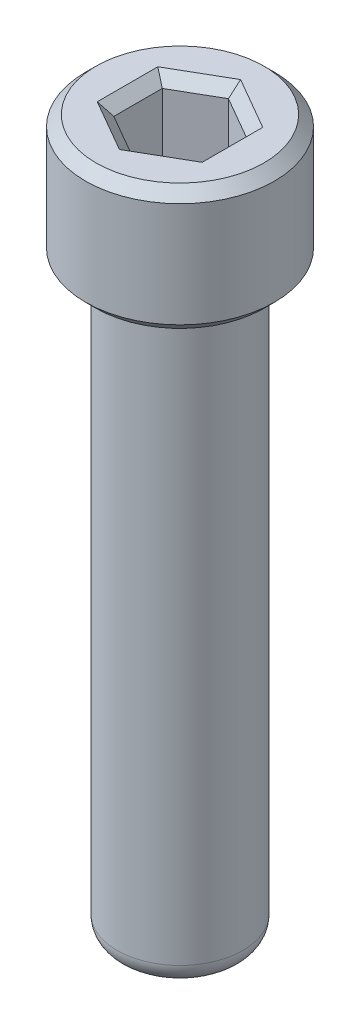
ISO-10303-21;
HEADER;
FILE_DESCRIPTION(('STEP AP214'),'2;1');
FILE_NAME('part.step','',(''),(''),'','','');
FILE_SCHEMA(('AUTOMOTIVE_DESIGN { 1 0 10303 214 1 1 1 1 }'));
ENDSEC;
DATA;
#1=APPLICATION_CONTEXT('core data for automotive mechanical design processes');
#2=APPLICATION_PROTOCOL_DEFINITION('international standard','automotive_design',2000,#1);
#3=PRODUCT_CONTEXT('',#1,'mechanical');
#4=PRODUCT('Part','Part','',(#3));
#5=PRODUCT_RELATED_PRODUCT_CATEGORY('part','',(#4));
#6=PRODUCT_DEFINITION_FORMATION('','',#4);
#7=PRODUCT_DEFINITION_CONTEXT('part definition',#1,'design');
#8=PRODUCT_DEFINITION('design','',#6,#7);
#9=PRODUCT_DEFINITION_SHAPE('','',#8);
#10=(LENGTH_UNIT() NAMED_UNIT(*) SI_UNIT(.MILLI.,.METRE.));
#11=(NAMED_UNIT(*) PLANE_ANGLE_UNIT() SI_UNIT($,.RADIAN.));
#12=(NAMED_UNIT(*) SI_UNIT($,.STERADIAN.) SOLID_ANGLE_UNIT());
#13=UNCERTAINTY_MEASURE_WITH_UNIT(LENGTH_MEASURE(1.E-05),#10,'distance_accuracy_value','');
#14=(GEOMETRIC_REPRESENTATION_CONTEXT(3) GLOBAL_UNCERTAINTY_ASSIGNED_CONTEXT((#13)) GLOBAL_UNIT_ASSIGNED_CONTEXT((#10,
#11,#12)) REPRESENTATION_CONTEXT('',''));
#15=CARTESIAN_POINT('',(0.,0.,0.));
#16=DIRECTION('',(0.,0.,1.));
#17=DIRECTION('',(1.,0.,0.));
#18=AXIS2_PLACEMENT_3D('',#15,#16,#17);
#19=CARTESIAN_POINT('',(0.,14.,0.));
#20=DIRECTION('',(0.,-1.,0.));
#21=DIRECTION('',(0.,0.,-1.));
#22=AXIS2_PLACEMENT_3D('',#19,#20,#21);
#23=CYLINDRICAL_SURFACE('',#22,1.5);
#24=CARTESIAN_POINT('',(0.,0.5,0.));
#25=DIRECTION('',(0.,1.,0.));
#26=DIRECTION('',(0.,0.,1.));
#27=AXIS2_PLACEMENT_3D('',#24,#25,#26);
#28=CIRCLE('',#27,1.5);
#29=CARTESIAN_POINT('',(0.,0.5,1.5));
#30=VERTEX_POINT('',#29);
#31=EDGE_CURVE('E58',#30,#30,#28,.T.);
#32=ORIENTED_EDGE('',*,*,#31,.T.);
#33=EDGE_LOOP('',(#32));
#34=FACE_BOUND('',#33,.T.);
#35=CARTESIAN_POINT('',(0.,14.,0.));
#36=DIRECTION('',(0.,1.,0.));
#37=DIRECTION('',(0.,0.,1.));
#38=AXIS2_PLACEMENT_3D('',#35,#36,#37);
#39=CIRCLE('',#38,1.5);
#40=CARTESIAN_POINT('',(0.,14.,1.5));
#41=VERTEX_POINT('',#40);
#42=EDGE_CURVE('E171',#41,#41,#39,.T.);
#43=ORIENTED_EDGE('',*,*,#42,.F.);
#44=EDGE_LOOP('',(#43));
#45=FACE_BOUND('',#44,.T.);
#46=ADVANCED_FACE('F49',(#34,#45),#23,.T.);
#47=CARTESIAN_POINT('',(0.,0.,0.));
#48=DIRECTION('',(0.,1.,0.));
#49=DIRECTION('',(0.,0.,1.));
#50=AXIS2_PLACEMENT_3D('',#47,#48,#49);
#51=PLANE('',#50);
#52=CARTESIAN_POINT('',(0.,0.,0.));
#53=DIRECTION('',(0.,1.,0.));
#54=DIRECTION('',(0.,0.,1.));
#55=AXIS2_PLACEMENT_3D('',#52,#53,#54);
#56=CIRCLE('',#55,1.);
#57=CARTESIAN_POINT('',(0.,0.,1.));
#58=VERTEX_POINT('',#57);
#59=EDGE_CURVE('E11',#58,#58,#56,.F.);
#60=ORIENTED_EDGE('',*,*,#59,.T.);
#61=EDGE_LOOP('',(#60));
#62=FACE_BOUND('',#61,.T.);
#63=ADVANCED_FACE('F272',(#62),#51,.F.);
#64=CARTESIAN_POINT('',(0.,17.,0.));
#65=DIRECTION('',(0.,-1.,0.));
#66=DIRECTION('',(0.,0.,-1.));
#67=AXIS2_PLACEMENT_3D('',#64,#65,#66);
#68=CYLINDRICAL_SURFACE('',#67,2.25);
#69=CARTESIAN_POINT('',(0.,14.25,0.));
#70=DIRECTION('',(0.,1.,0.));
#71=DIRECTION('',(0.,0.,1.));
#72=AXIS2_PLACEMENT_3D('',#69,#70,#71);
#73=CIRCLE('',#72,2.25);
#74=CARTESIAN_POINT('',(0.,14.25,2.25));
#75=VERTEX_POINT('',#74);
#76=EDGE_CURVE('E191',#75,#75,#73,.T.);
#77=ORIENTED_EDGE('',*,*,#76,.T.);
#78=EDGE_LOOP('',(#77));
#79=FACE_BOUND('',#78,.T.);
#80=CARTESIAN_POINT('',(0.,16.75,0.));
#81=DIRECTION('',(0.,1.,0.));
#82=DIRECTION('',(0.,0.,1.));
#83=AXIS2_PLACEMENT_3D('',#80,#81,#82);
#84=CIRCLE('',#83,2.25);
#85=CARTESIAN_POINT('',(0.,16.75,2.25));
#86=VERTEX_POINT('',#85);
#87=EDGE_CURVE('E187',#86,#86,#84,.F.);
#88=ORIENTED_EDGE('',*,*,#87,.T.);
#89=EDGE_LOOP('',(#88));
#90=FACE_BOUND('',#89,.T.);
#91=ADVANCED_FACE('F276',(#79,#90),#68,.T.);
#92=CARTESIAN_POINT('',(0.,17.,0.));
#93=DIRECTION('',(0.,1.,0.));
#94=DIRECTION('',(0.,0.,1.));
#95=AXIS2_PLACEMENT_3D('',#92,#93,#94);
#96=PLANE('',#95);
#97=CARTESIAN_POINT('',(0.,17.,0.));
#98=DIRECTION('',(0.,1.,0.));
#99=DIRECTION('',(0.,0.,1.));
#100=AXIS2_PLACEMENT_3D('',#97,#98,#99);
#101=CIRCLE('',#100,2.);
#102=CARTESIAN_POINT('',(0.,17.,2.));
#103=VERTEX_POINT('',#102);
#104=EDGE_CURVE('E218',#103,#103,#101,.T.);
#105=ORIENTED_EDGE('',*,*,#104,.T.);
#106=EDGE_LOOP('',(#105));
#107=FACE_BOUND('',#106,.T.);
#108=DIRECTION('',(-0.866025403784439,0.,0.5));
#109=VECTOR('',#108,1.);
#110=CARTESIAN_POINT('',(0.124999999999999,17.,1.37120688932536));
#111=LINE('',#110,#109);
#112=CARTESIAN_POINT('',(1.25,17.,0.721687836487032));
#113=VERTEX_POINT('',#112);
#114=CARTESIAN_POINT('',(0.,17.,1.44337567297406));
#115=VERTEX_POINT('',#114);
#116=EDGE_CURVE('E199',#113,#115,#111,.T.);
#117=ORIENTED_EDGE('',*,*,#116,.T.);
#118=DIRECTION('',(-0.866025403784439,0.,-0.5));
#119=VECTOR('',#118,1.);
#120=CARTESIAN_POINT('',(-1.125,17.,0.793856620135735));
#121=LINE('',#120,#119);
#122=CARTESIAN_POINT('',(-1.25,17.,0.721687836487032));
#123=VERTEX_POINT('',#122);
#124=EDGE_CURVE('E214',#115,#123,#121,.T.);
#125=ORIENTED_EDGE('',*,*,#124,.T.);
#126=DIRECTION('',(0.,0.,-1.));
#127=VECTOR('',#126,1.);
#128=CARTESIAN_POINT('',(-1.25,17.,-0.577350269189626));
#129=LINE('',#128,#127);
#130=CARTESIAN_POINT('',(-1.25,17.,-0.721687836487033));
#131=VERTEX_POINT('',#130);
#132=EDGE_CURVE('E211',#123,#131,#129,.T.);
#133=ORIENTED_EDGE('',*,*,#132,.T.);
#134=DIRECTION('',(0.866025403784439,0.,-0.5));
#135=VECTOR('',#134,1.);
#136=CARTESIAN_POINT('',(-0.125,17.,-1.37120688932536));
#137=LINE('',#136,#135);
#138=CARTESIAN_POINT('',(0.,17.,-1.44337567297406));
#139=VERTEX_POINT('',#138);
#140=EDGE_CURVE('E208',#131,#139,#137,.T.);
#141=ORIENTED_EDGE('',*,*,#140,.T.);
#142=DIRECTION('',(0.866025403784439,0.,0.5));
#143=VECTOR('',#142,1.);
#144=CARTESIAN_POINT('',(1.125,17.,-0.793856620135736));
#145=LINE('',#144,#143);
#146=CARTESIAN_POINT('',(1.25,17.,-0.721687836487033));
#147=VERTEX_POINT('',#146);
#148=EDGE_CURVE('E205',#139,#147,#145,.T.);
#149=ORIENTED_EDGE('',*,*,#148,.T.);
#150=DIRECTION('',(0.,0.,1.));
#151=VECTOR('',#150,1.);
#152=CARTESIAN_POINT('',(1.25,17.,0.577350269189625));
#153=LINE('',#152,#151);
#154=EDGE_CURVE('E202',#147,#113,#153,.T.);
#155=ORIENTED_EDGE('',*,*,#154,.T.);
#156=EDGE_LOOP('',(#117,#125,#133,#141,#149,#155));
#157=FACE_BOUND('',#156,.T.);
#158=ADVANCED_FACE('F338',(#107,#157),#96,.T.);
#159=CARTESIAN_POINT('',(0.,14.,0.));
#160=DIRECTION('',(0.,1.,0.));
#161=DIRECTION('',(0.,0.,1.));
#162=AXIS2_PLACEMENT_3D('',#159,#160,#161);
#163=PLANE('',#162);
#164=CARTESIAN_POINT('',(0.,14.,0.));
#165=DIRECTION('',(0.,1.,0.));
#166=DIRECTION('',(0.,0.,1.));
#167=AXIS2_PLACEMENT_3D('',#164,#165,#166);
#168=CIRCLE('',#167,2.);
#169=CARTESIAN_POINT('',(0.,14.,2.));
#170=VERTEX_POINT('',#169);
#171=EDGE_CURVE('E195',#170,#170,#168,.F.);
#172=ORIENTED_EDGE('',*,*,#171,.T.);
#173=EDGE_LOOP('',(#172));
#174=FACE_BOUND('',#173,.T.);
#175=ORIENTED_EDGE('',*,*,#42,.T.);
#176=EDGE_LOOP('',(#175));
#177=FACE_BOUND('',#176,.T.);
#178=ADVANCED_FACE('F372',(#174,#177),#163,.F.);
#179=CARTESIAN_POINT('',(1.,15.,-0.577350269189627));
#180=DIRECTION('',(0.5,0.,-0.866025403784439));
#181=DIRECTION('',(-0.866025403784439,0.,-0.5));
#182=AXIS2_PLACEMENT_3D('',#179,#180,#181);
#183=PLANE('',#182);
#184=DIRECTION('',(0.,1.,0.));
#185=VECTOR('',#184,1.);
#186=CARTESIAN_POINT('',(1.,15.,-0.577350269189627));
#187=LINE('',#186,#185);
#188=CARTESIAN_POINT('',(1.,15.,-0.577350269189627));
#189=VERTEX_POINT('',#188);
#190=CARTESIAN_POINT('',(1.,16.75,-0.577350269189627));
#191=VERTEX_POINT('',#190);
#192=EDGE_CURVE('E168',#189,#191,#187,.T.);
#193=ORIENTED_EDGE('',*,*,#192,.T.);
#194=DIRECTION('',(-0.866025403784439,0.,-0.5));
#195=VECTOR('',#194,1.);
#196=CARTESIAN_POINT('',(0.,16.75,-1.15470053837925));
#197=LINE('',#196,#195);
#198=CARTESIAN_POINT('',(0.,16.75,-1.15470053837925));
#199=VERTEX_POINT('',#198);
#200=EDGE_CURVE('E129',#191,#199,#197,.T.);
#201=ORIENTED_EDGE('',*,*,#200,.T.);
#202=DIRECTION('',(0.,1.,0.));
#203=VECTOR('',#202,1.);
#204=CARTESIAN_POINT('',(0.,15.,-1.15470053837925));
#205=LINE('',#204,#203);
#206=CARTESIAN_POINT('',(0.,15.,-1.15470053837925));
#207=VERTEX_POINT('',#206);
#208=EDGE_CURVE('E122',#207,#199,#205,.T.);
#209=ORIENTED_EDGE('',*,*,#208,.F.);
#210=DIRECTION('',(-0.866025403784439,0.,-0.5));
#211=VECTOR('',#210,1.);
#212=CARTESIAN_POINT('',(1.,15.,-0.577350269189627));
#213=LINE('',#212,#211);
#214=EDGE_CURVE('E126',#189,#207,#213,.T.);
#215=ORIENTED_EDGE('',*,*,#214,.F.);
#216=EDGE_LOOP('',(#193,#201,#209,#215));
#217=FACE_BOUND('',#216,.T.);
#218=ADVANCED_FACE('F124',(#217),#183,.F.);
#219=CARTESIAN_POINT('',(1.,15.,0.577350269189625));
#220=DIRECTION('',(1.,0.,0.));
#221=DIRECTION('',(0.,0.,-1.));
#222=AXIS2_PLACEMENT_3D('',#219,#220,#221);
#223=PLANE('',#222);
#224=DIRECTION('',(0.,1.,0.));
#225=VECTOR('',#224,1.);
#226=CARTESIAN_POINT('',(1.,15.,0.577350269189625));
#227=LINE('',#226,#225);
#228=CARTESIAN_POINT('',(1.,15.,0.577350269189625));
#229=VERTEX_POINT('',#228);
#230=CARTESIAN_POINT('',(1.,16.75,0.577350269189625));
#231=VERTEX_POINT('',#230);
#232=EDGE_CURVE('E172',#229,#231,#227,.T.);
#233=ORIENTED_EDGE('',*,*,#232,.T.);
#234=DIRECTION('',(0.,0.,-1.));
#235=VECTOR('',#234,1.);
#236=CARTESIAN_POINT('',(1.,16.75,-0.577350269189627));
#237=LINE('',#236,#235);
#238=EDGE_CURVE('E72',#231,#191,#237,.T.);
#239=ORIENTED_EDGE('',*,*,#238,.T.);
#240=ORIENTED_EDGE('',*,*,#192,.F.);
#241=DIRECTION('',(0.,0.,-1.));
#242=VECTOR('',#241,1.);
#243=CARTESIAN_POINT('',(1.,15.,0.577350269189625));
#244=LINE('',#243,#242);
#245=EDGE_CURVE('E134',#229,#189,#244,.T.);
#246=ORIENTED_EDGE('',*,*,#245,.F.);
#247=EDGE_LOOP('',(#233,#239,#240,#246));
#248=FACE_BOUND('',#247,.T.);
#249=ADVANCED_FACE('F353',(#248),#223,.F.);
#250=CARTESIAN_POINT('',(0.,15.,1.15470053837925));
#251=DIRECTION('',(0.5,0.,0.866025403784439));
#252=DIRECTION('',(0.866025403784439,0.,-0.5));
#253=AXIS2_PLACEMENT_3D('',#250,#251,#252);
#254=PLANE('',#253);
#255=DIRECTION('',(0.,1.,0.));
#256=VECTOR('',#255,1.);
#257=CARTESIAN_POINT('',(0.,15.,1.15470053837925));
#258=LINE('',#257,#256);
#259=CARTESIAN_POINT('',(0.,15.,1.15470053837925));
#260=VERTEX_POINT('',#259);
#261=CARTESIAN_POINT('',(0.,16.75,1.15470053837925));
#262=VERTEX_POINT('',#261);
#263=EDGE_CURVE('E175',#260,#262,#258,.T.);
#264=ORIENTED_EDGE('',*,*,#263,.T.);
#265=DIRECTION('',(0.866025403784439,0.,-0.5));
#266=VECTOR('',#265,1.);
#267=CARTESIAN_POINT('',(1.,16.75,0.577350269189625));
#268=LINE('',#267,#266);
#269=EDGE_CURVE('E65',#262,#231,#268,.T.);
#270=ORIENTED_EDGE('',*,*,#269,.T.);
#271=ORIENTED_EDGE('',*,*,#232,.F.);
#272=DIRECTION('',(0.866025403784439,0.,-0.5));
#273=VECTOR('',#272,1.);
#274=CARTESIAN_POINT('',(0.,15.,1.15470053837925));
#275=LINE('',#274,#273);
#276=EDGE_CURVE('E163',#260,#229,#275,.T.);
#277=ORIENTED_EDGE('',*,*,#276,.F.);
#278=EDGE_LOOP('',(#264,#270,#271,#277));
#279=FACE_BOUND('',#278,.T.);
#280=ADVANCED_FACE('F355',(#279),#254,.F.);
#281=CARTESIAN_POINT('',(-1.,15.,0.577350269189626));
#282=DIRECTION('',(-0.5,0.,0.866025403784439));
#283=DIRECTION('',(0.866025403784439,0.,0.5));
#284=AXIS2_PLACEMENT_3D('',#281,#282,#283);
#285=PLANE('',#284);
#286=DIRECTION('',(0.,1.,0.));
#287=VECTOR('',#286,1.);
#288=CARTESIAN_POINT('',(-1.,15.,0.577350269189626));
#289=LINE('',#288,#287);
#290=CARTESIAN_POINT('',(-1.,15.,0.577350269189626));
#291=VERTEX_POINT('',#290);
#292=CARTESIAN_POINT('',(-1.,16.75,0.577350269189626));
#293=VERTEX_POINT('',#292);
#294=EDGE_CURVE('E178',#291,#293,#289,.T.);
#295=ORIENTED_EDGE('',*,*,#294,.T.);
#296=DIRECTION('',(0.866025403784439,0.,0.5));
#297=VECTOR('',#296,1.);
#298=CARTESIAN_POINT('',(0.,16.75,1.15470053837925));
#299=LINE('',#298,#297);
#300=EDGE_CURVE('E222',#293,#262,#299,.T.);
#301=ORIENTED_EDGE('',*,*,#300,.T.);
#302=ORIENTED_EDGE('',*,*,#263,.F.);
#303=DIRECTION('',(0.866025403784439,0.,0.5));
#304=VECTOR('',#303,1.);
#305=CARTESIAN_POINT('',(-1.,15.,0.577350269189626));
#306=LINE('',#305,#304);
#307=EDGE_CURVE('E159',#291,#260,#306,.T.);
#308=ORIENTED_EDGE('',*,*,#307,.F.);
#309=EDGE_LOOP('',(#295,#301,#302,#308));
#310=FACE_BOUND('',#309,.T.);
#311=ADVANCED_FACE('F351',(#310),#285,.F.);
#312=CARTESIAN_POINT('',(-1.,15.,-0.577350269189626));
#313=DIRECTION('',(-1.,0.,0.));
#314=DIRECTION('',(0.,0.,1.));
#315=AXIS2_PLACEMENT_3D('',#312,#313,#314);
#316=PLANE('',#315);
#317=DIRECTION('',(0.,1.,0.));
#318=VECTOR('',#317,1.);
#319=CARTESIAN_POINT('',(-1.,15.,-0.577350269189626));
#320=LINE('',#319,#318);
#321=CARTESIAN_POINT('',(-1.,15.,-0.577350269189626));
#322=VERTEX_POINT('',#321);
#323=CARTESIAN_POINT('',(-1.,16.75,-0.577350269189626));
#324=VERTEX_POINT('',#323);
#325=EDGE_CURVE('E133',#322,#324,#320,.T.);
#326=ORIENTED_EDGE('',*,*,#325,.T.);
#327=DIRECTION('',(0.,0.,1.));
#328=VECTOR('',#327,1.);
#329=CARTESIAN_POINT('',(-1.,16.75,0.577350269189626));
#330=LINE('',#329,#328);
#331=EDGE_CURVE('E226',#324,#293,#330,.T.);
#332=ORIENTED_EDGE('',*,*,#331,.T.);
#333=ORIENTED_EDGE('',*,*,#294,.F.);
#334=DIRECTION('',(0.,0.,1.));
#335=VECTOR('',#334,1.);
#336=CARTESIAN_POINT('',(-1.,15.,-0.577350269189626));
#337=LINE('',#336,#335);
#338=EDGE_CURVE('E144',#322,#291,#337,.T.);
#339=ORIENTED_EDGE('',*,*,#338,.F.);
#340=EDGE_LOOP('',(#326,#332,#333,#339));
#341=FACE_BOUND('',#340,.T.);
#342=ADVANCED_FACE('F348',(#341),#316,.F.);
#343=CARTESIAN_POINT('',(0.,15.,-1.15470053837925));
#344=DIRECTION('',(-0.5,0.,-0.866025403784439));
#345=DIRECTION('',(-0.866025403784439,0.,0.5));
#346=AXIS2_PLACEMENT_3D('',#343,#344,#345);
#347=PLANE('',#346);
#348=ORIENTED_EDGE('',*,*,#208,.T.);
#349=DIRECTION('',(-0.866025403784439,0.,0.5));
#350=VECTOR('',#349,1.);
#351=CARTESIAN_POINT('',(-1.,16.75,-0.577350269189626));
#352=LINE('',#351,#350);
#353=EDGE_CURVE('E229',#199,#324,#352,.T.);
#354=ORIENTED_EDGE('',*,*,#353,.T.);
#355=ORIENTED_EDGE('',*,*,#325,.F.);
#356=DIRECTION('',(-0.866025403784439,0.,0.5));
#357=VECTOR('',#356,1.);
#358=CARTESIAN_POINT('',(0.,15.,-1.15470053837925));
#359=LINE('',#358,#357);
#360=EDGE_CURVE('E137',#207,#322,#359,.T.);
#361=ORIENTED_EDGE('',*,*,#360,.F.);
#362=EDGE_LOOP('',(#348,#354,#355,#361));
#363=FACE_BOUND('',#362,.T.);
#364=ADVANCED_FACE('F138',(#363),#347,.F.);
#365=CARTESIAN_POINT('',(0.,15.,0.));
#366=DIRECTION('',(0.,1.,0.));
#367=DIRECTION('',(0.,0.,1.));
#368=AXIS2_PLACEMENT_3D('',#365,#366,#367);
#369=PLANE('',#368);
#370=ORIENTED_EDGE('',*,*,#214,.T.);
#371=ORIENTED_EDGE('',*,*,#360,.T.);
#372=ORIENTED_EDGE('',*,*,#338,.T.);
#373=ORIENTED_EDGE('',*,*,#307,.T.);
#374=ORIENTED_EDGE('',*,*,#276,.T.);
#375=ORIENTED_EDGE('',*,*,#245,.T.);
#376=EDGE_LOOP('',(#370,#371,#372,#373,#374,#375));
#377=FACE_BOUND('',#376,.T.);
#378=ADVANCED_FACE('F146',(#377),#369,.T.);
#379=CARTESIAN_POINT('',(0.,14.25,0.));
#380=DIRECTION('',(0.,1.,0.));
#381=DIRECTION('',(0.,0.,1.));
#382=AXIS2_PLACEMENT_3D('',#379,#380,#381);
#383=CONICAL_SURFACE('',#382,2.25,0.785398163397458);
#384=ORIENTED_EDGE('',*,*,#171,.F.);
#385=EDGE_LOOP('',(#384));
#386=FACE_BOUND('',#385,.T.);
#387=ORIENTED_EDGE('',*,*,#76,.F.);
#388=EDGE_LOOP('',(#387));
#389=FACE_BOUND('',#388,.T.);
#390=ADVANCED_FACE('F282',(#386,#389),#383,.T.);
#391=CARTESIAN_POINT('',(0.,17.,0.));
#392=DIRECTION('',(0.,-1.,0.));
#393=DIRECTION('',(0.,0.,-1.));
#394=AXIS2_PLACEMENT_3D('',#391,#392,#393);
#395=CONICAL_SURFACE('',#394,2.,0.785398163397447);
#396=ORIENTED_EDGE('',*,*,#87,.F.);
#397=EDGE_LOOP('',(#396));
#398=FACE_BOUND('',#397,.T.);
#399=ORIENTED_EDGE('',*,*,#104,.F.);
#400=EDGE_LOOP('',(#399));
#401=FACE_BOUND('',#400,.T.);
#402=ADVANCED_FACE('F288',(#398,#401),#395,.T.);
#403=CARTESIAN_POINT('',(1.,16.75,-0.577350269189627));
#404=DIRECTION('',(-0.353553390593274,0.707106781186546,0.612372435695796));
#405=DIRECTION('',(0.866025403784439,0.,0.5));
#406=AXIS2_PLACEMENT_3D('',#403,#404,#405);
#407=PLANE('',#406);
#408=DIRECTION('',(-0.654653670707976,-0.654653670707979,0.377964473009227));
#409=VECTOR('',#408,1.);
#410=CARTESIAN_POINT('',(1.,16.75,-0.577350269189627));
#411=LINE('',#410,#409);
#412=EDGE_CURVE('E154',#147,#191,#411,.T.);
#413=ORIENTED_EDGE('',*,*,#412,.F.);
#414=ORIENTED_EDGE('',*,*,#148,.F.);
#415=DIRECTION('',(0.,-0.654653670707979,0.755928946018453));
#416=VECTOR('',#415,1.);
#417=CARTESIAN_POINT('',(0.,16.75,-1.15470053837925));
#418=LINE('',#417,#416);
#419=EDGE_CURVE('E150',#199,#139,#418,.F.);
#420=ORIENTED_EDGE('',*,*,#419,.F.);
#421=ORIENTED_EDGE('',*,*,#200,.F.);
#422=EDGE_LOOP('',(#413,#414,#420,#421));
#423=FACE_BOUND('',#422,.T.);
#424=ADVANCED_FACE('F294',(#423),#407,.T.);
#425=CARTESIAN_POINT('',(0.,16.75,-1.15470053837925));
#426=DIRECTION('',(0.353553390593274,0.707106781186546,0.612372435695796));
#427=DIRECTION('',(0.866025403784439,0.,-0.5));
#428=AXIS2_PLACEMENT_3D('',#425,#426,#427);
#429=PLANE('',#428);
#430=ORIENTED_EDGE('',*,*,#419,.T.);
#431=ORIENTED_EDGE('',*,*,#140,.F.);
#432=DIRECTION('',(0.654653670707976,-0.654653670707978,0.377964473009227));
#433=VECTOR('',#432,1.);
#434=CARTESIAN_POINT('',(-1.,16.75,-0.577350269189626));
#435=LINE('',#434,#433);
#436=EDGE_CURVE('E248',#324,#131,#435,.F.);
#437=ORIENTED_EDGE('',*,*,#436,.F.);
#438=ORIENTED_EDGE('',*,*,#353,.F.);
#439=EDGE_LOOP('',(#430,#431,#437,#438));
#440=FACE_BOUND('',#439,.T.);
#441=ADVANCED_FACE('F320',(#440),#429,.T.);
#442=CARTESIAN_POINT('',(1.,16.75,0.577350269189625));
#443=DIRECTION('',(-0.707106781186549,0.707106781186546,0.));
#444=DIRECTION('',(0.,0.,1.));
#445=AXIS2_PLACEMENT_3D('',#442,#443,#444);
#446=PLANE('',#445);
#447=ORIENTED_EDGE('',*,*,#412,.T.);
#448=ORIENTED_EDGE('',*,*,#238,.F.);
#449=DIRECTION('',(-0.654653670707976,-0.654653670707979,-0.377964473009227));
#450=VECTOR('',#449,1.);
#451=CARTESIAN_POINT('',(1.,16.75,0.577350269189625));
#452=LINE('',#451,#450);
#453=EDGE_CURVE('E244',#113,#231,#452,.T.);
#454=ORIENTED_EDGE('',*,*,#453,.F.);
#455=ORIENTED_EDGE('',*,*,#154,.F.);
#456=EDGE_LOOP('',(#447,#448,#454,#455));
#457=FACE_BOUND('',#456,.T.);
#458=ADVANCED_FACE('F313',(#457),#446,.T.);
#459=CARTESIAN_POINT('',(-1.,16.75,-0.577350269189626));
#460=DIRECTION('',(0.707106781186549,0.707106781186546,0.));
#461=DIRECTION('',(0.,0.,-1.));
#462=AXIS2_PLACEMENT_3D('',#459,#460,#461);
#463=PLANE('',#462);
#464=ORIENTED_EDGE('',*,*,#436,.T.);
#465=ORIENTED_EDGE('',*,*,#132,.F.);
#466=DIRECTION('',(0.654653670707976,-0.654653670707979,-0.377964473009225));
#467=VECTOR('',#466,1.);
#468=CARTESIAN_POINT('',(-1.,16.75,0.577350269189626));
#469=LINE('',#468,#467);
#470=EDGE_CURVE('E241',#293,#123,#469,.F.);
#471=ORIENTED_EDGE('',*,*,#470,.F.);
#472=ORIENTED_EDGE('',*,*,#331,.F.);
#473=EDGE_LOOP('',(#464,#465,#471,#472));
#474=FACE_BOUND('',#473,.T.);
#475=ADVANCED_FACE('F306',(#474),#463,.T.);
#476=CARTESIAN_POINT('',(0.,16.75,1.15470053837925));
#477=DIRECTION('',(-0.353553390593274,0.707106781186546,-0.612372435695796));
#478=DIRECTION('',(-0.866025403784439,0.,0.5));
#479=AXIS2_PLACEMENT_3D('',#476,#477,#478);
#480=PLANE('',#479);
#481=ORIENTED_EDGE('',*,*,#453,.T.);
#482=ORIENTED_EDGE('',*,*,#269,.F.);
#483=DIRECTION('',(0.,0.654653670707979,0.755928946018453));
#484=VECTOR('',#483,1.);
#485=CARTESIAN_POINT('',(0.,16.4642857142857,0.824786098842323));
#486=LINE('',#485,#484);
#487=EDGE_CURVE('E238',#115,#262,#486,.F.);
#488=ORIENTED_EDGE('',*,*,#487,.F.);
#489=ORIENTED_EDGE('',*,*,#116,.F.);
#490=EDGE_LOOP('',(#481,#482,#488,#489));
#491=FACE_BOUND('',#490,.T.);
#492=ADVANCED_FACE('F267',(#491),#480,.T.);
#493=CARTESIAN_POINT('',(-1.,16.75,0.577350269189626));
#494=DIRECTION('',(0.353553390593275,0.707106781186546,-0.612372435695796));
#495=DIRECTION('',(-0.866025403784439,0.,-0.5));
#496=AXIS2_PLACEMENT_3D('',#493,#494,#495);
#497=PLANE('',#496);
#498=ORIENTED_EDGE('',*,*,#470,.T.);
#499=ORIENTED_EDGE('',*,*,#124,.F.);
#500=ORIENTED_EDGE('',*,*,#487,.T.);
#501=ORIENTED_EDGE('',*,*,#300,.F.);
#502=EDGE_LOOP('',(#498,#499,#500,#501));
#503=FACE_BOUND('',#502,.T.);
#504=ADVANCED_FACE('F261',(#503),#497,.T.);
#505=CARTESIAN_POINT('',(0.,0.5,0.));
#506=DIRECTION('',(0.,1.,0.));
#507=DIRECTION('',(0.,0.,1.));
#508=AXIS2_PLACEMENT_3D('',#505,#506,#507);
#509=TOROIDAL_SURFACE('',#508,1.,0.5);
#510=ORIENTED_EDGE('',*,*,#59,.F.);
#511=EDGE_LOOP('',(#510));
#512=FACE_BOUND('',#511,.T.);
#513=ORIENTED_EDGE('',*,*,#31,.F.);
#514=EDGE_LOOP('',(#513));
#515=FACE_BOUND('',#514,.T.);
#516=ADVANCED_FACE('F51',(#512,#515),#509,.T.);
#517=CLOSED_SHELL('',(#46,#63,#91,#158,#178,#218,#249,#280,#311,#342,#364,#378,#390,#402,#424,
#441,#458,#475,#492,#504,#516));
#518=MANIFOLD_SOLID_BREP('B2',#517);
#519=ADVANCED_BREP_SHAPE_REPRESENTATION('',(#18,#518),#14);
#520=SHAPE_DEFINITION_REPRESENTATION(#9,#519);
ENDSEC;
END-ISO-10303-21;
